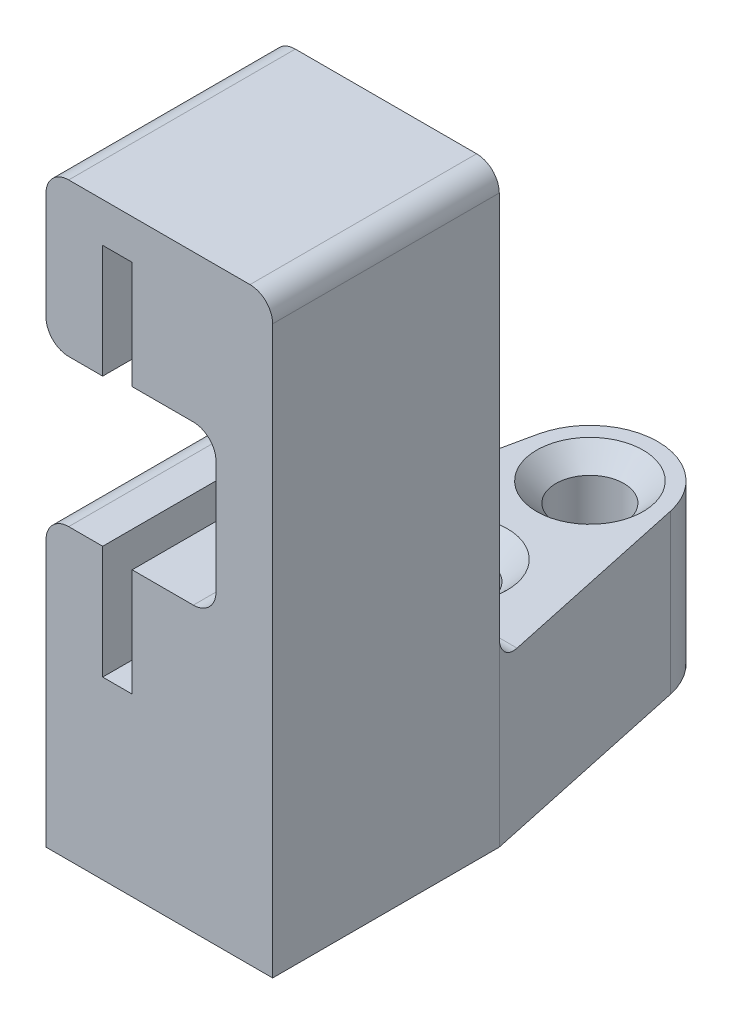
ISO-10303-21;
HEADER;
FILE_DESCRIPTION(('STEP AP214'),'2;1');
FILE_NAME('part.step','',(''),(''),'','','');
FILE_SCHEMA(('AUTOMOTIVE_DESIGN { 1 0 10303 214 1 1 1 1 }'));
ENDSEC;
DATA;
#1=APPLICATION_CONTEXT('core data for automotive mechanical design processes');
#2=APPLICATION_PROTOCOL_DEFINITION('international standard','automotive_design',2000,#1);
#3=PRODUCT_CONTEXT('',#1,'mechanical');
#4=PRODUCT('Part','Part','',(#3));
#5=PRODUCT_RELATED_PRODUCT_CATEGORY('part','',(#4));
#6=PRODUCT_DEFINITION_FORMATION('','',#4);
#7=PRODUCT_DEFINITION_CONTEXT('part definition',#1,'design');
#8=PRODUCT_DEFINITION('design','',#6,#7);
#9=PRODUCT_DEFINITION_SHAPE('','',#8);
#10=(LENGTH_UNIT() NAMED_UNIT(*) SI_UNIT(.MILLI.,.METRE.));
#11=(NAMED_UNIT(*) PLANE_ANGLE_UNIT() SI_UNIT($,.RADIAN.));
#12=(NAMED_UNIT(*) SI_UNIT($,.STERADIAN.) SOLID_ANGLE_UNIT());
#13=UNCERTAINTY_MEASURE_WITH_UNIT(LENGTH_MEASURE(1.E-05),#10,'distance_accuracy_value','');
#14=(GEOMETRIC_REPRESENTATION_CONTEXT(3) GLOBAL_UNCERTAINTY_ASSIGNED_CONTEXT((#13)) GLOBAL_UNIT_ASSIGNED_CONTEXT((#10,
#11,#12)) REPRESENTATION_CONTEXT('',''));
#15=CARTESIAN_POINT('',(0.,0.,0.));
#16=DIRECTION('',(0.,0.,1.));
#17=DIRECTION('',(1.,0.,0.));
#18=AXIS2_PLACEMENT_3D('',#15,#16,#17);
#19=CARTESIAN_POINT('',(0.,0.,-5.));
#20=DIRECTION('',(0.,0.,1.));
#21=DIRECTION('',(1.,0.,0.));
#22=AXIS2_PLACEMENT_3D('',#19,#20,#21);
#23=PLANE('',#22);
#24=DIRECTION('',(0.,1.,0.));
#25=VECTOR('',#24,1.);
#26=CARTESIAN_POINT('',(5.,0.,-5.));
#27=LINE('',#26,#25);
#28=CARTESIAN_POINT('',(5.,8.,-5.));
#29=VERTEX_POINT('',#28);
#30=CARTESIAN_POINT('',(5.,25.,-5.));
#31=VERTEX_POINT('',#30);
#32=EDGE_CURVE('E243',#29,#31,#27,.T.);
#33=ORIENTED_EDGE('',*,*,#32,.F.);
#34=DIRECTION('',(1.,0.,0.));
#35=VECTOR('',#34,1.);
#36=CARTESIAN_POINT('',(0.,8.,-5.));
#37=LINE('',#36,#35);
#38=CARTESIAN_POINT('',(-1.20000000000001,8.,-5.));
#39=VERTEX_POINT('',#38);
#40=EDGE_CURVE('E375',#29,#39,#37,.F.);
#41=ORIENTED_EDGE('',*,*,#40,.T.);
#42=DIRECTION('',(0.,-1.,0.));
#43=VECTOR('',#42,1.);
#44=CARTESIAN_POINT('',(-1.20000000000001,12.5,-5.));
#45=LINE('',#44,#43);
#46=CARTESIAN_POINT('',(-1.20000000000001,12.5,-5.));
#47=VERTEX_POINT('',#46);
#48=EDGE_CURVE('E325',#47,#39,#45,.T.);
#49=ORIENTED_EDGE('',*,*,#48,.F.);
#50=DIRECTION('',(-1.,0.,0.));
#51=VECTOR('',#50,1.);
#52=CARTESIAN_POINT('',(2.5,12.5,-5.));
#53=LINE('',#52,#51);
#54=CARTESIAN_POINT('',(1.5,12.5,-5.));
#55=VERTEX_POINT('',#54);
#56=EDGE_CURVE('E323',#55,#47,#53,.T.);
#57=ORIENTED_EDGE('',*,*,#56,.F.);
#58=CARTESIAN_POINT('',(1.5,13.5,-5.));
#59=DIRECTION('',(0.,0.,1.));
#60=DIRECTION('',(1.,0.,0.));
#61=AXIS2_PLACEMENT_3D('',#58,#59,#60);
#62=CIRCLE('',#61,1.);
#63=CARTESIAN_POINT('',(2.5,13.5,-5.));
#64=VERTEX_POINT('',#63);
#65=EDGE_CURVE('E41',#55,#64,#62,.T.);
#66=ORIENTED_EDGE('',*,*,#65,.T.);
#67=DIRECTION('',(0.,-1.,0.));
#68=VECTOR('',#67,1.);
#69=CARTESIAN_POINT('',(2.5,19.5,-5.));
#70=LINE('',#69,#68);
#71=CARTESIAN_POINT('',(2.5,18.5,-5.));
#72=VERTEX_POINT('',#71);
#73=EDGE_CURVE('E320',#72,#64,#70,.T.);
#74=ORIENTED_EDGE('',*,*,#73,.F.);
#75=CARTESIAN_POINT('',(1.5,18.5,-5.));
#76=DIRECTION('',(0.,0.,1.));
#77=DIRECTION('',(1.,0.,0.));
#78=AXIS2_PLACEMENT_3D('',#75,#76,#77);
#79=CIRCLE('',#78,1.);
#80=CARTESIAN_POINT('',(1.5,19.5,-5.));
#81=VERTEX_POINT('',#80);
#82=EDGE_CURVE('E564',#72,#81,#79,.T.);
#83=ORIENTED_EDGE('',*,*,#82,.T.);
#84=DIRECTION('',(1.,0.,0.));
#85=VECTOR('',#84,1.);
#86=CARTESIAN_POINT('',(-1.20000000000001,19.5,-5.));
#87=LINE('',#86,#85);
#88=CARTESIAN_POINT('',(-1.20000000000001,19.5,-5.));
#89=VERTEX_POINT('',#88);
#90=EDGE_CURVE('E317',#89,#81,#87,.T.);
#91=ORIENTED_EDGE('',*,*,#90,.F.);
#92=DIRECTION('',(0.,-1.,0.));
#93=VECTOR('',#92,1.);
#94=CARTESIAN_POINT('',(-1.20000000000001,24.25,-5.));
#95=LINE('',#94,#93);
#96=CARTESIAN_POINT('',(-1.20000000000001,24.25,-5.));
#97=VERTEX_POINT('',#96);
#98=EDGE_CURVE('E315',#97,#89,#95,.T.);
#99=ORIENTED_EDGE('',*,*,#98,.F.);
#100=DIRECTION('',(1.,0.,0.));
#101=VECTOR('',#100,1.);
#102=CARTESIAN_POINT('',(-2.50000000000001,24.25,-5.));
#103=LINE('',#102,#101);
#104=CARTESIAN_POINT('',(-2.50000000000001,24.25,-5.));
#105=VERTEX_POINT('',#104);
#106=EDGE_CURVE('E313',#105,#97,#103,.T.);
#107=ORIENTED_EDGE('',*,*,#106,.F.);
#108=DIRECTION('',(0.,1.,0.));
#109=VECTOR('',#108,1.);
#110=CARTESIAN_POINT('',(-2.50000000000001,19.25,-5.));
#111=LINE('',#110,#109);
#112=CARTESIAN_POINT('',(-2.50000000000001,19.25,-5.));
#113=VERTEX_POINT('',#112);
#114=EDGE_CURVE('E311',#113,#105,#111,.T.);
#115=ORIENTED_EDGE('',*,*,#114,.F.);
#116=DIRECTION('',(1.,0.,0.));
#117=VECTOR('',#116,1.);
#118=CARTESIAN_POINT('',(-5.00000000000001,19.25,-5.));
#119=LINE('',#118,#117);
#120=CARTESIAN_POINT('',(-4.00000000000001,19.25,-5.));
#121=VERTEX_POINT('',#120);
#122=EDGE_CURVE('E309',#121,#113,#119,.T.);
#123=ORIENTED_EDGE('',*,*,#122,.F.);
#124=CARTESIAN_POINT('',(-4.00000000000001,20.25,-5.));
#125=DIRECTION('',(0.,0.,1.));
#126=DIRECTION('',(1.,0.,0.));
#127=AXIS2_PLACEMENT_3D('',#124,#125,#126);
#128=CIRCLE('',#127,1.);
#129=CARTESIAN_POINT('',(-5.00000000000001,20.25,-5.));
#130=VERTEX_POINT('',#129);
#131=EDGE_CURVE('E370',#121,#130,#128,.F.);
#132=ORIENTED_EDGE('',*,*,#131,.T.);
#133=DIRECTION('',(0.,-1.,0.));
#134=VECTOR('',#133,1.);
#135=CARTESIAN_POINT('',(-5.00000000000001,26.,-5.));
#136=LINE('',#135,#134);
#137=CARTESIAN_POINT('',(-5.00000000000001,25.,-5.));
#138=VERTEX_POINT('',#137);
#139=EDGE_CURVE('E306',#138,#130,#136,.T.);
#140=ORIENTED_EDGE('',*,*,#139,.F.);
#141=CARTESIAN_POINT('',(-4.00000000000001,25.,-5.));
#142=DIRECTION('',(0.,0.,1.));
#143=DIRECTION('',(1.,0.,0.));
#144=AXIS2_PLACEMENT_3D('',#141,#142,#143);
#145=CIRCLE('',#144,1.);
#146=CARTESIAN_POINT('',(-4.00000000000001,26.,-5.));
#147=VERTEX_POINT('',#146);
#148=EDGE_CURVE('E364',#138,#147,#145,.F.);
#149=ORIENTED_EDGE('',*,*,#148,.T.);
#150=DIRECTION('',(-1.,0.,0.));
#151=VECTOR('',#150,1.);
#152=CARTESIAN_POINT('',(5.,26.,-5.));
#153=LINE('',#152,#151);
#154=CARTESIAN_POINT('',(4.,26.,-5.));
#155=VERTEX_POINT('',#154);
#156=EDGE_CURVE('E303',#155,#147,#153,.T.);
#157=ORIENTED_EDGE('',*,*,#156,.F.);
#158=CARTESIAN_POINT('',(4.,25.,-5.));
#159=DIRECTION('',(0.,0.,1.));
#160=DIRECTION('',(1.,0.,0.));
#161=AXIS2_PLACEMENT_3D('',#158,#159,#160);
#162=CIRCLE('',#161,1.);
#163=EDGE_CURVE('E366',#155,#31,#162,.F.);
#164=ORIENTED_EDGE('',*,*,#163,.T.);
#165=EDGE_LOOP('',(#33,#41,#49,#57,#66,#74,#83,#91,#99,#107,#115,#123,#132,#140,#149,#157,#164));
#166=FACE_BOUND('',#165,.T.);
#167=ADVANCED_FACE('F32',(#166),#23,.F.);
#168=DIRECTION('',(0.,1.,0.));
#169=VECTOR('',#168,1.);
#170=CARTESIAN_POINT('',(-2.50000000000001,7.75,-5.));
#171=LINE('',#170,#169);
#172=CARTESIAN_POINT('',(-2.50000000000001,8.,-5.));
#173=VERTEX_POINT('',#172);
#174=CARTESIAN_POINT('',(-2.50000000000001,12.75,-5.));
#175=VERTEX_POINT('',#174);
#176=EDGE_CURVE('E328',#173,#175,#171,.T.);
#177=ORIENTED_EDGE('',*,*,#176,.F.);
#178=DIRECTION('',(1.,0.,0.));
#179=VECTOR('',#178,1.);
#180=CARTESIAN_POINT('',(0.,8.,-5.));
#181=LINE('',#180,#179);
#182=CARTESIAN_POINT('',(-5.00000000000001,8.,-5.));
#183=VERTEX_POINT('',#182);
#184=EDGE_CURVE('E372',#173,#183,#181,.F.);
#185=ORIENTED_EDGE('',*,*,#184,.T.);
#186=DIRECTION('',(0.,-1.,0.));
#187=VECTOR('',#186,1.);
#188=CARTESIAN_POINT('',(-5.00000000000001,12.75,-5.));
#189=LINE('',#188,#187);
#190=CARTESIAN_POINT('',(-5.00000000000001,11.75,-5.));
#191=VERTEX_POINT('',#190);
#192=EDGE_CURVE('E267',#191,#183,#189,.T.);
#193=ORIENTED_EDGE('',*,*,#192,.F.);
#194=CARTESIAN_POINT('',(-4.00000000000001,11.75,-5.));
#195=DIRECTION('',(0.,0.,1.));
#196=DIRECTION('',(1.,0.,0.));
#197=AXIS2_PLACEMENT_3D('',#194,#195,#196);
#198=CIRCLE('',#197,1.);
#199=CARTESIAN_POINT('',(-4.00000000000001,12.75,-5.));
#200=VERTEX_POINT('',#199);
#201=EDGE_CURVE('E368',#191,#200,#198,.F.);
#202=ORIENTED_EDGE('',*,*,#201,.T.);
#203=DIRECTION('',(-1.,0.,0.));
#204=VECTOR('',#203,1.);
#205=CARTESIAN_POINT('',(-2.50000000000001,12.75,-5.));
#206=LINE('',#205,#204);
#207=EDGE_CURVE('E330',#175,#200,#206,.T.);
#208=ORIENTED_EDGE('',*,*,#207,.F.);
#209=EDGE_LOOP('',(#177,#185,#193,#202,#208));
#210=FACE_BOUND('',#209,.T.);
#211=ADVANCED_FACE('F461',(#210),#23,.F.);
#212=CARTESIAN_POINT('',(5.,0.,5.));
#213=DIRECTION('',(-1.,0.,0.));
#214=DIRECTION('',(0.,0.,1.));
#215=AXIS2_PLACEMENT_3D('',#212,#213,#214);
#216=PLANE('',#215);
#217=ORIENTED_EDGE('',*,*,#32,.T.);
#218=DIRECTION('',(0.,0.,-1.));
#219=VECTOR('',#218,1.);
#220=CARTESIAN_POINT('',(5.,25.,5.));
#221=LINE('',#220,#219);
#222=CARTESIAN_POINT('',(5.,25.,5.));
#223=VERTEX_POINT('',#222);
#224=EDGE_CURVE('E412',#31,#223,#221,.F.);
#225=ORIENTED_EDGE('',*,*,#224,.T.);
#226=DIRECTION('',(0.,1.,0.));
#227=VECTOR('',#226,1.);
#228=CARTESIAN_POINT('',(5.,0.,5.));
#229=LINE('',#228,#227);
#230=CARTESIAN_POINT('',(5.,0.,5.));
#231=VERTEX_POINT('',#230);
#232=EDGE_CURVE('E263',#231,#223,#229,.T.);
#233=ORIENTED_EDGE('',*,*,#232,.F.);
#234=DIRECTION('',(0.,0.,-1.));
#235=VECTOR('',#234,1.);
#236=CARTESIAN_POINT('',(5.,0.,5.));
#237=LINE('',#236,#235);
#238=CARTESIAN_POINT('',(5.,0.,-5.));
#239=VERTEX_POINT('',#238);
#240=EDGE_CURVE('E301',#231,#239,#237,.T.);
#241=ORIENTED_EDGE('',*,*,#240,.T.);
#242=EDGE_CURVE('E61',#239,#29,#27,.T.);
#243=ORIENTED_EDGE('',*,*,#242,.T.);
#244=EDGE_LOOP('',(#217,#225,#233,#241,#243));
#245=FACE_BOUND('',#244,.T.);
#246=ADVANCED_FACE('F436',(#245),#216,.F.);
#247=CARTESIAN_POINT('',(5.,26.,5.));
#248=DIRECTION('',(0.,-1.,0.));
#249=DIRECTION('',(1.,0.,0.));
#250=AXIS2_PLACEMENT_3D('',#247,#248,#249);
#251=PLANE('',#250);
#252=DIRECTION('',(-1.,0.,0.));
#253=VECTOR('',#252,1.);
#254=CARTESIAN_POINT('',(5.,26.,5.));
#255=LINE('',#254,#253);
#256=CARTESIAN_POINT('',(4.,26.,5.));
#257=VERTEX_POINT('',#256);
#258=CARTESIAN_POINT('',(-4.00000000000001,26.,5.));
#259=VERTEX_POINT('',#258);
#260=EDGE_CURVE('E266',#257,#259,#255,.T.);
#261=ORIENTED_EDGE('',*,*,#260,.F.);
#262=DIRECTION('',(0.,0.,-1.));
#263=VECTOR('',#262,1.);
#264=CARTESIAN_POINT('',(4.,26.,5.));
#265=LINE('',#264,#263);
#266=EDGE_CURVE('E409',#257,#155,#265,.T.);
#267=ORIENTED_EDGE('',*,*,#266,.T.);
#268=ORIENTED_EDGE('',*,*,#156,.T.);
#269=DIRECTION('',(0.,0.,-1.));
#270=VECTOR('',#269,1.);
#271=CARTESIAN_POINT('',(-4.00000000000001,26.,5.));
#272=LINE('',#271,#270);
#273=EDGE_CURVE('E407',#147,#259,#272,.F.);
#274=ORIENTED_EDGE('',*,*,#273,.T.);
#275=EDGE_LOOP('',(#261,#267,#268,#274));
#276=FACE_BOUND('',#275,.T.);
#277=ADVANCED_FACE('F525',(#276),#251,.F.);
#278=CARTESIAN_POINT('',(-5.00000000000001,26.,5.));
#279=DIRECTION('',(1.,0.,0.));
#280=DIRECTION('',(0.,1.,0.));
#281=AXIS2_PLACEMENT_3D('',#278,#279,#280);
#282=PLANE('',#281);
#283=ORIENTED_EDGE('',*,*,#139,.T.);
#284=DIRECTION('',(0.,0.,-1.));
#285=VECTOR('',#284,1.);
#286=CARTESIAN_POINT('',(-5.00000000000001,20.25,5.));
#287=LINE('',#286,#285);
#288=CARTESIAN_POINT('',(-5.00000000000001,20.25,5.));
#289=VERTEX_POINT('',#288);
#290=EDGE_CURVE('E390',#130,#289,#287,.F.);
#291=ORIENTED_EDGE('',*,*,#290,.T.);
#292=DIRECTION('',(0.,-1.,0.));
#293=VECTOR('',#292,1.);
#294=CARTESIAN_POINT('',(-5.00000000000001,26.,5.));
#295=LINE('',#294,#293);
#296=CARTESIAN_POINT('',(-5.00000000000001,25.,5.));
#297=VERTEX_POINT('',#296);
#298=EDGE_CURVE('E270',#297,#289,#295,.T.);
#299=ORIENTED_EDGE('',*,*,#298,.F.);
#300=DIRECTION('',(0.,0.,-1.));
#301=VECTOR('',#300,1.);
#302=CARTESIAN_POINT('',(-5.00000000000001,25.,5.));
#303=LINE('',#302,#301);
#304=EDGE_CURVE('E387',#297,#138,#303,.T.);
#305=ORIENTED_EDGE('',*,*,#304,.T.);
#306=EDGE_LOOP('',(#283,#291,#299,#305));
#307=FACE_BOUND('',#306,.T.);
#308=ADVANCED_FACE('F522',(#307),#282,.F.);
#309=CARTESIAN_POINT('',(-5.00000000000001,19.25,5.));
#310=DIRECTION('',(0.,1.,0.));
#311=DIRECTION('',(-1.,0.,0.));
#312=AXIS2_PLACEMENT_3D('',#309,#310,#311);
#313=PLANE('',#312);
#314=DIRECTION('',(1.,0.,0.));
#315=VECTOR('',#314,1.);
#316=CARTESIAN_POINT('',(-5.00000000000001,19.25,5.));
#317=LINE('',#316,#315);
#318=CARTESIAN_POINT('',(-4.00000000000001,19.25,5.));
#319=VERTEX_POINT('',#318);
#320=CARTESIAN_POINT('',(-2.50000000000001,19.25,5.));
#321=VERTEX_POINT('',#320);
#322=EDGE_CURVE('E273',#319,#321,#317,.T.);
#323=ORIENTED_EDGE('',*,*,#322,.F.);
#324=DIRECTION('',(0.,0.,-1.));
#325=VECTOR('',#324,1.);
#326=CARTESIAN_POINT('',(-4.00000000000001,19.25,5.));
#327=LINE('',#326,#325);
#328=EDGE_CURVE('E384',#319,#121,#327,.T.);
#329=ORIENTED_EDGE('',*,*,#328,.T.);
#330=ORIENTED_EDGE('',*,*,#122,.T.);
#331=DIRECTION('',(0.,0.,-1.));
#332=VECTOR('',#331,1.);
#333=CARTESIAN_POINT('',(-2.50000000000001,19.25,5.));
#334=LINE('',#333,#332);
#335=EDGE_CURVE('E357',#321,#113,#334,.T.);
#336=ORIENTED_EDGE('',*,*,#335,.F.);
#337=EDGE_LOOP('',(#323,#329,#330,#336));
#338=FACE_BOUND('',#337,.T.);
#339=ADVANCED_FACE('F518',(#338),#313,.F.);
#340=CARTESIAN_POINT('',(-2.50000000000001,19.25,5.));
#341=DIRECTION('',(-1.,0.,0.));
#342=DIRECTION('',(0.,-1.,0.));
#343=AXIS2_PLACEMENT_3D('',#340,#341,#342);
#344=PLANE('',#343);
#345=ORIENTED_EDGE('',*,*,#114,.T.);
#346=DIRECTION('',(0.,0.,-1.));
#347=VECTOR('',#346,1.);
#348=CARTESIAN_POINT('',(-2.50000000000001,24.25,5.));
#349=LINE('',#348,#347);
#350=CARTESIAN_POINT('',(-2.50000000000001,24.25,5.));
#351=VERTEX_POINT('',#350);
#352=EDGE_CURVE('E354',#351,#105,#349,.T.);
#353=ORIENTED_EDGE('',*,*,#352,.F.);
#354=DIRECTION('',(0.,1.,0.));
#355=VECTOR('',#354,1.);
#356=CARTESIAN_POINT('',(-2.50000000000001,19.25,5.));
#357=LINE('',#356,#355);
#358=EDGE_CURVE('E275',#321,#351,#357,.T.);
#359=ORIENTED_EDGE('',*,*,#358,.F.);
#360=ORIENTED_EDGE('',*,*,#335,.T.);
#361=EDGE_LOOP('',(#345,#353,#359,#360));
#362=FACE_BOUND('',#361,.T.);
#363=ADVANCED_FACE('F514',(#362),#344,.F.);
#364=CARTESIAN_POINT('',(-2.50000000000001,24.25,5.));
#365=DIRECTION('',(0.,1.,0.));
#366=DIRECTION('',(0.,0.,1.));
#367=AXIS2_PLACEMENT_3D('',#364,#365,#366);
#368=PLANE('',#367);
#369=ORIENTED_EDGE('',*,*,#106,.T.);
#370=DIRECTION('',(0.,0.,-1.));
#371=VECTOR('',#370,1.);
#372=CARTESIAN_POINT('',(-1.20000000000001,24.25,5.));
#373=LINE('',#372,#371);
#374=CARTESIAN_POINT('',(-1.20000000000001,24.25,5.));
#375=VERTEX_POINT('',#374);
#376=EDGE_CURVE('E351',#375,#97,#373,.T.);
#377=ORIENTED_EDGE('',*,*,#376,.F.);
#378=DIRECTION('',(1.,0.,0.));
#379=VECTOR('',#378,1.);
#380=CARTESIAN_POINT('',(-2.50000000000001,24.25,5.));
#381=LINE('',#380,#379);
#382=EDGE_CURVE('E277',#351,#375,#381,.T.);
#383=ORIENTED_EDGE('',*,*,#382,.F.);
#384=ORIENTED_EDGE('',*,*,#352,.T.);
#385=EDGE_LOOP('',(#369,#377,#383,#384));
#386=FACE_BOUND('',#385,.T.);
#387=ADVANCED_FACE('F510',(#386),#368,.F.);
#388=CARTESIAN_POINT('',(-1.20000000000001,24.25,5.));
#389=DIRECTION('',(1.,0.,0.));
#390=DIRECTION('',(0.,0.,-1.));
#391=AXIS2_PLACEMENT_3D('',#388,#389,#390);
#392=PLANE('',#391);
#393=ORIENTED_EDGE('',*,*,#98,.T.);
#394=DIRECTION('',(0.,0.,-1.));
#395=VECTOR('',#394,1.);
#396=CARTESIAN_POINT('',(-1.20000000000001,19.5,5.));
#397=LINE('',#396,#395);
#398=CARTESIAN_POINT('',(-1.20000000000001,19.5,5.));
#399=VERTEX_POINT('',#398);
#400=EDGE_CURVE('E348',#399,#89,#397,.T.);
#401=ORIENTED_EDGE('',*,*,#400,.F.);
#402=DIRECTION('',(0.,-1.,0.));
#403=VECTOR('',#402,1.);
#404=CARTESIAN_POINT('',(-1.20000000000001,24.25,5.));
#405=LINE('',#404,#403);
#406=EDGE_CURVE('E279',#375,#399,#405,.T.);
#407=ORIENTED_EDGE('',*,*,#406,.F.);
#408=ORIENTED_EDGE('',*,*,#376,.T.);
#409=EDGE_LOOP('',(#393,#401,#407,#408));
#410=FACE_BOUND('',#409,.T.);
#411=ADVANCED_FACE('F506',(#410),#392,.F.);
#412=CARTESIAN_POINT('',(-1.20000000000001,19.5,5.));
#413=DIRECTION('',(0.,1.,0.));
#414=DIRECTION('',(0.,0.,1.));
#415=AXIS2_PLACEMENT_3D('',#412,#413,#414);
#416=PLANE('',#415);
#417=ORIENTED_EDGE('',*,*,#90,.T.);
#418=DIRECTION('',(0.,0.,-1.));
#419=VECTOR('',#418,1.);
#420=CARTESIAN_POINT('',(1.5,19.5,5.));
#421=LINE('',#420,#419);
#422=CARTESIAN_POINT('',(1.5,19.5,5.));
#423=VERTEX_POINT('',#422);
#424=EDGE_CURVE('E382',#81,#423,#421,.F.);
#425=ORIENTED_EDGE('',*,*,#424,.T.);
#426=DIRECTION('',(1.,0.,0.));
#427=VECTOR('',#426,1.);
#428=CARTESIAN_POINT('',(-1.20000000000001,19.5,5.));
#429=LINE('',#428,#427);
#430=EDGE_CURVE('E281',#399,#423,#429,.T.);
#431=ORIENTED_EDGE('',*,*,#430,.F.);
#432=ORIENTED_EDGE('',*,*,#400,.T.);
#433=EDGE_LOOP('',(#417,#425,#431,#432));
#434=FACE_BOUND('',#433,.T.);
#435=ADVANCED_FACE('F502',(#434),#416,.F.);
#436=CARTESIAN_POINT('',(2.5,19.5,5.));
#437=DIRECTION('',(1.,0.,0.));
#438=DIRECTION('',(0.,1.,0.));
#439=AXIS2_PLACEMENT_3D('',#436,#437,#438);
#440=PLANE('',#439);
#441=DIRECTION('',(0.,-1.,0.));
#442=VECTOR('',#441,1.);
#443=CARTESIAN_POINT('',(2.5,19.5,5.));
#444=LINE('',#443,#442);
#445=CARTESIAN_POINT('',(2.5,18.5,5.));
#446=VERTEX_POINT('',#445);
#447=CARTESIAN_POINT('',(2.5,13.5,5.));
#448=VERTEX_POINT('',#447);
#449=EDGE_CURVE('E284',#446,#448,#444,.T.);
#450=ORIENTED_EDGE('',*,*,#449,.F.);
#451=DIRECTION('',(0.,0.,-1.));
#452=VECTOR('',#451,1.);
#453=CARTESIAN_POINT('',(2.5,18.5,-5.));
#454=LINE('',#453,#452);
#455=EDGE_CURVE('E379',#446,#72,#454,.T.);
#456=ORIENTED_EDGE('',*,*,#455,.T.);
#457=ORIENTED_EDGE('',*,*,#73,.T.);
#458=DIRECTION('',(0.,0.,-1.));
#459=VECTOR('',#458,1.);
#460=CARTESIAN_POINT('',(2.5,13.5,5.));
#461=LINE('',#460,#459);
#462=EDGE_CURVE('E377',#64,#448,#461,.F.);
#463=ORIENTED_EDGE('',*,*,#462,.T.);
#464=EDGE_LOOP('',(#450,#456,#457,#463));
#465=FACE_BOUND('',#464,.T.);
#466=ADVANCED_FACE('F498',(#465),#440,.F.);
#467=CARTESIAN_POINT('',(2.5,12.5,5.));
#468=DIRECTION('',(0.,-1.,0.));
#469=DIRECTION('',(0.,0.,-1.));
#470=AXIS2_PLACEMENT_3D('',#467,#468,#469);
#471=PLANE('',#470);
#472=DIRECTION('',(-1.,0.,0.));
#473=VECTOR('',#472,1.);
#474=CARTESIAN_POINT('',(2.5,12.5,5.));
#475=LINE('',#474,#473);
#476=CARTESIAN_POINT('',(1.5,12.5,5.));
#477=VERTEX_POINT('',#476);
#478=CARTESIAN_POINT('',(-1.20000000000001,12.5,5.));
#479=VERTEX_POINT('',#478);
#480=EDGE_CURVE('E287',#477,#479,#475,.T.);
#481=ORIENTED_EDGE('',*,*,#480,.F.);
#482=DIRECTION('',(0.,0.,-1.));
#483=VECTOR('',#482,1.);
#484=CARTESIAN_POINT('',(1.5,12.5,-5.));
#485=LINE('',#484,#483);
#486=EDGE_CURVE('E404',#477,#55,#485,.T.);
#487=ORIENTED_EDGE('',*,*,#486,.T.);
#488=ORIENTED_EDGE('',*,*,#56,.T.);
#489=DIRECTION('',(0.,0.,-1.));
#490=VECTOR('',#489,1.);
#491=CARTESIAN_POINT('',(-1.20000000000001,12.5,5.));
#492=LINE('',#491,#490);
#493=EDGE_CURVE('E345',#479,#47,#492,.T.);
#494=ORIENTED_EDGE('',*,*,#493,.F.);
#495=EDGE_LOOP('',(#481,#487,#488,#494));
#496=FACE_BOUND('',#495,.T.);
#497=ADVANCED_FACE('F494',(#496),#471,.F.);
#498=CARTESIAN_POINT('',(-1.20000000000001,12.5,5.));
#499=DIRECTION('',(1.,0.,0.));
#500=DIRECTION('',(0.,1.,0.));
#501=AXIS2_PLACEMENT_3D('',#498,#499,#500);
#502=PLANE('',#501);
#503=ORIENTED_EDGE('',*,*,#48,.T.);
#504=CARTESIAN_POINT('',(-1.20000000000001,8.,-6.));
#505=DIRECTION('',(1.,0.,0.));
#506=DIRECTION('',(0.,1.,0.));
#507=AXIS2_PLACEMENT_3D('',#504,#505,#506);
#508=CIRCLE('',#507,1.);
#509=CARTESIAN_POINT('',(-1.20000000000001,7.75,-5.03175416344815));
#510=VERTEX_POINT('',#509);
#511=EDGE_CURVE('E545',#39,#510,#508,.T.);
#512=ORIENTED_EDGE('',*,*,#511,.T.);
#513=DIRECTION('',(0.,0.,-1.));
#514=VECTOR('',#513,1.);
#515=CARTESIAN_POINT('',(-1.20000000000001,7.75,5.));
#516=LINE('',#515,#514);
#517=CARTESIAN_POINT('',(-1.20000000000001,7.75,5.));
#518=VERTEX_POINT('',#517);
#519=EDGE_CURVE('E343',#518,#510,#516,.T.);
#520=ORIENTED_EDGE('',*,*,#519,.F.);
#521=DIRECTION('',(0.,-1.,0.));
#522=VECTOR('',#521,1.);
#523=CARTESIAN_POINT('',(-1.20000000000001,12.5,5.));
#524=LINE('',#523,#522);
#525=EDGE_CURVE('E289',#479,#518,#524,.T.);
#526=ORIENTED_EDGE('',*,*,#525,.F.);
#527=ORIENTED_EDGE('',*,*,#493,.T.);
#528=EDGE_LOOP('',(#503,#512,#520,#526,#527));
#529=FACE_BOUND('',#528,.T.);
#530=ADVANCED_FACE('F490',(#529),#502,.F.);
#531=CARTESIAN_POINT('',(-1.20000000000001,7.75,5.));
#532=DIRECTION('',(0.,-1.,0.));
#533=DIRECTION('',(0.,0.,-1.));
#534=AXIS2_PLACEMENT_3D('',#531,#532,#533);
#535=PLANE('',#534);
#536=ORIENTED_EDGE('',*,*,#519,.T.);
#537=DIRECTION('',(1.,0.,0.));
#538=VECTOR('',#537,1.);
#539=CARTESIAN_POINT('',(-1.20000000000001,7.75,-5.03175416344815));
#540=LINE('',#539,#538);
#541=CARTESIAN_POINT('',(-2.50000000000001,7.75,-5.03175416344815));
#542=VERTEX_POINT('',#541);
#543=EDGE_CURVE('E573',#510,#542,#540,.F.);
#544=ORIENTED_EDGE('',*,*,#543,.T.);
#545=DIRECTION('',(0.,0.,-1.));
#546=VECTOR('',#545,1.);
#547=CARTESIAN_POINT('',(-2.50000000000001,7.75,5.));
#548=LINE('',#547,#546);
#549=CARTESIAN_POINT('',(-2.50000000000001,7.75,5.));
#550=VERTEX_POINT('',#549);
#551=EDGE_CURVE('E49',#550,#542,#548,.T.);
#552=ORIENTED_EDGE('',*,*,#551,.F.);
#553=DIRECTION('',(-1.,0.,0.));
#554=VECTOR('',#553,1.);
#555=CARTESIAN_POINT('',(-1.20000000000001,7.75,5.));
#556=LINE('',#555,#554);
#557=EDGE_CURVE('E291',#518,#550,#556,.T.);
#558=ORIENTED_EDGE('',*,*,#557,.F.);
#559=EDGE_LOOP('',(#536,#544,#552,#558));
#560=FACE_BOUND('',#559,.T.);
#561=ADVANCED_FACE('F487',(#560),#535,.F.);
#562=CARTESIAN_POINT('',(-2.50000000000001,7.75,5.));
#563=DIRECTION('',(-1.,0.,0.));
#564=DIRECTION('',(0.,-1.,0.));
#565=AXIS2_PLACEMENT_3D('',#562,#563,#564);
#566=PLANE('',#565);
#567=ORIENTED_EDGE('',*,*,#551,.T.);
#568=CARTESIAN_POINT('',(-2.50000000000001,8.,-6.));
#569=DIRECTION('',(-1.,0.,0.));
#570=DIRECTION('',(0.,-1.,0.));
#571=AXIS2_PLACEMENT_3D('',#568,#569,#570);
#572=CIRCLE('',#571,1.);
#573=EDGE_CURVE('E569',#542,#173,#572,.T.);
#574=ORIENTED_EDGE('',*,*,#573,.T.);
#575=ORIENTED_EDGE('',*,*,#176,.T.);
#576=DIRECTION('',(0.,0.,-1.));
#577=VECTOR('',#576,1.);
#578=CARTESIAN_POINT('',(-2.50000000000001,12.75,5.));
#579=LINE('',#578,#577);
#580=CARTESIAN_POINT('',(-2.50000000000001,12.75,5.));
#581=VERTEX_POINT('',#580);
#582=EDGE_CURVE('E339',#581,#175,#579,.T.);
#583=ORIENTED_EDGE('',*,*,#582,.F.);
#584=DIRECTION('',(0.,1.,0.));
#585=VECTOR('',#584,1.);
#586=CARTESIAN_POINT('',(-2.50000000000001,7.75,5.));
#587=LINE('',#586,#585);
#588=EDGE_CURVE('E293',#550,#581,#587,.T.);
#589=ORIENTED_EDGE('',*,*,#588,.F.);
#590=EDGE_LOOP('',(#567,#574,#575,#583,#589));
#591=FACE_BOUND('',#590,.T.);
#592=ADVANCED_FACE('F483',(#591),#566,.F.);
#593=CARTESIAN_POINT('',(-2.50000000000001,12.75,5.));
#594=DIRECTION('',(0.,-1.,0.));
#595=DIRECTION('',(0.,0.,-1.));
#596=AXIS2_PLACEMENT_3D('',#593,#594,#595);
#597=PLANE('',#596);
#598=ORIENTED_EDGE('',*,*,#207,.T.);
#599=DIRECTION('',(0.,0.,-1.));
#600=VECTOR('',#599,1.);
#601=CARTESIAN_POINT('',(-4.00000000000001,12.75,5.));
#602=LINE('',#601,#600);
#603=CARTESIAN_POINT('',(-4.00000000000001,12.75,5.));
#604=VERTEX_POINT('',#603);
#605=EDGE_CURVE('E402',#200,#604,#602,.F.);
#606=ORIENTED_EDGE('',*,*,#605,.T.);
#607=DIRECTION('',(-1.,0.,0.));
#608=VECTOR('',#607,1.);
#609=CARTESIAN_POINT('',(-2.50000000000001,12.75,5.));
#610=LINE('',#609,#608);
#611=EDGE_CURVE('E295',#581,#604,#610,.T.);
#612=ORIENTED_EDGE('',*,*,#611,.F.);
#613=ORIENTED_EDGE('',*,*,#582,.T.);
#614=EDGE_LOOP('',(#598,#606,#612,#613));
#615=FACE_BOUND('',#614,.T.);
#616=ADVANCED_FACE('F479',(#615),#597,.F.);
#617=CARTESIAN_POINT('',(-5.00000000000001,12.75,5.));
#618=DIRECTION('',(1.,0.,0.));
#619=DIRECTION('',(0.,1.,0.));
#620=AXIS2_PLACEMENT_3D('',#617,#618,#619);
#621=PLANE('',#620);
#622=DIRECTION('',(0.,-1.,0.));
#623=VECTOR('',#622,1.);
#624=CARTESIAN_POINT('',(-5.00000000000001,12.75,5.));
#625=LINE('',#624,#623);
#626=CARTESIAN_POINT('',(-5.00000000000001,11.75,5.));
#627=VERTEX_POINT('',#626);
#628=CARTESIAN_POINT('',(-5.,0.,5.));
#629=VERTEX_POINT('',#628);
#630=EDGE_CURVE('E297',#627,#629,#625,.T.);
#631=ORIENTED_EDGE('',*,*,#630,.F.);
#632=DIRECTION('',(0.,0.,-1.));
#633=VECTOR('',#632,1.);
#634=CARTESIAN_POINT('',(-5.00000000000001,11.75,5.));
#635=LINE('',#634,#633);
#636=EDGE_CURVE('E399',#627,#191,#635,.T.);
#637=ORIENTED_EDGE('',*,*,#636,.T.);
#638=ORIENTED_EDGE('',*,*,#192,.T.);
#639=DIRECTION('',(0.,-1.,0.));
#640=VECTOR('',#639,1.);
#641=CARTESIAN_POINT('',(-5.00000000000001,7.,-5.));
#642=LINE('',#641,#640);
#643=CARTESIAN_POINT('',(-5.,0.,-5.));
#644=VERTEX_POINT('',#643);
#645=EDGE_CURVE('E251',#183,#644,#642,.T.);
#646=ORIENTED_EDGE('',*,*,#645,.T.);
#647=DIRECTION('',(0.,0.,-1.));
#648=VECTOR('',#647,1.);
#649=CARTESIAN_POINT('',(-5.,0.,5.));
#650=LINE('',#649,#648);
#651=EDGE_CURVE('E336',#629,#644,#650,.T.);
#652=ORIENTED_EDGE('',*,*,#651,.F.);
#653=EDGE_LOOP('',(#631,#637,#638,#646,#652));
#654=FACE_BOUND('',#653,.T.);
#655=ADVANCED_FACE('F475',(#654),#621,.F.);
#656=CARTESIAN_POINT('',(-5.,0.,5.));
#657=DIRECTION('',(0.,1.,0.));
#658=DIRECTION('',(-1.,0.,0.));
#659=AXIS2_PLACEMENT_3D('',#656,#657,#658);
#660=PLANE('',#659);
#661=CARTESIAN_POINT('',(0.,0.,-14.));
#662=DIRECTION('',(0.,1.,0.));
#663=DIRECTION('',(0.,0.,1.));
#664=AXIS2_PLACEMENT_3D('',#661,#662,#663);
#665=CIRCLE('',#664,1.5);
#666=CARTESIAN_POINT('',(0.,0.,-12.5));
#667=VERTEX_POINT('',#666);
#668=EDGE_CURVE('E593',#667,#667,#665,.T.);
#669=ORIENTED_EDGE('',*,*,#668,.T.);
#670=EDGE_LOOP('',(#669));
#671=FACE_BOUND('',#670,.T.);
#672=CARTESIAN_POINT('',(0.,0.,-8.));
#673=DIRECTION('',(0.,1.,0.));
#674=DIRECTION('',(0.,0.,1.));
#675=AXIS2_PLACEMENT_3D('',#672,#673,#674);
#676=CIRCLE('',#675,1.5);
#677=CARTESIAN_POINT('',(0.,0.,-6.5));
#678=VERTEX_POINT('',#677);
#679=EDGE_CURVE('E257',#678,#678,#676,.T.);
#680=ORIENTED_EDGE('',*,*,#679,.T.);
#681=EDGE_LOOP('',(#680));
#682=FACE_BOUND('',#681,.T.);
#683=ORIENTED_EDGE('',*,*,#651,.T.);
#684=DIRECTION('',(-0.20985178310359,0.,0.977733209586462));
#685=VECTOR('',#684,1.);
#686=CARTESIAN_POINT('',(-2.93319962875939,0.,-14.6295553493108));
#687=LINE('',#686,#685);
#688=CARTESIAN_POINT('',(-2.93319962875939,0.,-14.6295553493108));
#689=VERTEX_POINT('',#688);
#690=EDGE_CURVE('E234',#689,#644,#687,.T.);
#691=ORIENTED_EDGE('',*,*,#690,.F.);
#692=CARTESIAN_POINT('',(0.,0.,-14.));
#693=DIRECTION('',(0.,1.,0.));
#694=DIRECTION('',(0.,0.,1.));
#695=AXIS2_PLACEMENT_3D('',#692,#693,#694);
#696=CIRCLE('',#695,3.);
#697=CARTESIAN_POINT('',(2.93319962875938,0.,-14.6295553493108));
#698=VERTEX_POINT('',#697);
#699=EDGE_CURVE('E256',#698,#689,#696,.T.);
#700=ORIENTED_EDGE('',*,*,#699,.F.);
#701=DIRECTION('',(-0.20985178310359,0.,-0.977733209586462));
#702=VECTOR('',#701,1.);
#703=CARTESIAN_POINT('',(5.,0.,-5.));
#704=LINE('',#703,#702);
#705=EDGE_CURVE('E240',#239,#698,#704,.T.);
#706=ORIENTED_EDGE('',*,*,#705,.F.);
#707=ORIENTED_EDGE('',*,*,#240,.F.);
#708=DIRECTION('',(1.,0.,0.));
#709=VECTOR('',#708,1.);
#710=CARTESIAN_POINT('',(-5.,0.,5.));
#711=LINE('',#710,#709);
#712=EDGE_CURVE('E299',#629,#231,#711,.T.);
#713=ORIENTED_EDGE('',*,*,#712,.F.);
#714=EDGE_LOOP('',(#683,#691,#700,#706,#707,#713));
#715=FACE_BOUND('',#714,.T.);
#716=ADVANCED_FACE('F472',(#671,#682,#715),#660,.F.);
#717=CARTESIAN_POINT('',(0.,0.,5.));
#718=DIRECTION('',(0.,0.,1.));
#719=DIRECTION('',(1.,0.,0.));
#720=AXIS2_PLACEMENT_3D('',#717,#718,#719);
#721=PLANE('',#720);
#722=ORIENTED_EDGE('',*,*,#298,.T.);
#723=CARTESIAN_POINT('',(-4.00000000000001,20.25,5.));
#724=DIRECTION('',(0.,0.,1.));
#725=DIRECTION('',(1.,0.,0.));
#726=AXIS2_PLACEMENT_3D('',#723,#724,#725);
#727=CIRCLE('',#726,1.);
#728=EDGE_CURVE('E397',#289,#319,#727,.T.);
#729=ORIENTED_EDGE('',*,*,#728,.T.);
#730=ORIENTED_EDGE('',*,*,#322,.T.);
#731=ORIENTED_EDGE('',*,*,#358,.T.);
#732=ORIENTED_EDGE('',*,*,#382,.T.);
#733=ORIENTED_EDGE('',*,*,#406,.T.);
#734=ORIENTED_EDGE('',*,*,#430,.T.);
#735=CARTESIAN_POINT('',(1.5,18.5,5.));
#736=DIRECTION('',(0.,0.,1.));
#737=DIRECTION('',(1.,0.,0.));
#738=AXIS2_PLACEMENT_3D('',#735,#736,#737);
#739=CIRCLE('',#738,1.);
#740=EDGE_CURVE('E558',#423,#446,#739,.F.);
#741=ORIENTED_EDGE('',*,*,#740,.T.);
#742=ORIENTED_EDGE('',*,*,#449,.T.);
#743=CARTESIAN_POINT('',(1.5,13.5,5.));
#744=DIRECTION('',(0.,0.,1.));
#745=DIRECTION('',(1.,0.,0.));
#746=AXIS2_PLACEMENT_3D('',#743,#744,#745);
#747=CIRCLE('',#746,1.);
#748=EDGE_CURVE('E11',#448,#477,#747,.F.);
#749=ORIENTED_EDGE('',*,*,#748,.T.);
#750=ORIENTED_EDGE('',*,*,#480,.T.);
#751=ORIENTED_EDGE('',*,*,#525,.T.);
#752=ORIENTED_EDGE('',*,*,#557,.T.);
#753=ORIENTED_EDGE('',*,*,#588,.T.);
#754=ORIENTED_EDGE('',*,*,#611,.T.);
#755=CARTESIAN_POINT('',(-4.00000000000001,11.75,5.));
#756=DIRECTION('',(0.,0.,1.));
#757=DIRECTION('',(1.,0.,0.));
#758=AXIS2_PLACEMENT_3D('',#755,#756,#757);
#759=CIRCLE('',#758,1.);
#760=EDGE_CURVE('E69',#604,#627,#759,.T.);
#761=ORIENTED_EDGE('',*,*,#760,.T.);
#762=ORIENTED_EDGE('',*,*,#630,.T.);
#763=ORIENTED_EDGE('',*,*,#712,.T.);
#764=ORIENTED_EDGE('',*,*,#232,.T.);
#765=CARTESIAN_POINT('',(4.,25.,5.));
#766=DIRECTION('',(0.,0.,1.));
#767=DIRECTION('',(1.,0.,0.));
#768=AXIS2_PLACEMENT_3D('',#765,#766,#767);
#769=CIRCLE('',#768,1.);
#770=EDGE_CURVE('E394',#223,#257,#769,.T.);
#771=ORIENTED_EDGE('',*,*,#770,.T.);
#772=ORIENTED_EDGE('',*,*,#260,.T.);
#773=CARTESIAN_POINT('',(-4.00000000000001,25.,5.));
#774=DIRECTION('',(0.,0.,1.));
#775=DIRECTION('',(1.,0.,0.));
#776=AXIS2_PLACEMENT_3D('',#773,#774,#775);
#777=CIRCLE('',#776,1.);
#778=EDGE_CURVE('E392',#259,#297,#777,.T.);
#779=ORIENTED_EDGE('',*,*,#778,.T.);
#780=EDGE_LOOP('',(#722,#729,#730,#731,#732,#733,#734,#741,#742,#749,#750,#751,#752,#753,#754,
#761,#762,#763,#764,#771,#772,#779));
#781=FACE_BOUND('',#780,.T.);
#782=ADVANCED_FACE('F470',(#781),#721,.T.);
#783=CARTESIAN_POINT('',(5.,7.,-5.));
#784=DIRECTION('',(-0.977733209586462,0.,0.20985178310359));
#785=DIRECTION('',(0.20985178310359,0.,0.977733209586462));
#786=AXIS2_PLACEMENT_3D('',#783,#784,#785);
#787=PLANE('',#786);
#788=ORIENTED_EDGE('',*,*,#705,.T.);
#789=DIRECTION('',(0.,-1.,0.));
#790=VECTOR('',#789,1.);
#791=CARTESIAN_POINT('',(2.93319962875938,7.,-14.6295553493108));
#792=LINE('',#791,#790);
#793=CARTESIAN_POINT('',(2.93319962875938,7.,-14.6295553493108));
#794=VERTEX_POINT('',#793);
#795=EDGE_CURVE('E237',#794,#698,#792,.T.);
#796=ORIENTED_EDGE('',*,*,#795,.F.);
#797=DIRECTION('',(-0.20985178310359,0.,-0.977733209586462));
#798=VECTOR('',#797,1.);
#799=CARTESIAN_POINT('',(5.,7.,-5.));
#800=LINE('',#799,#798);
#801=CARTESIAN_POINT('',(4.78536907507484,7.,-6.));
#802=VERTEX_POINT('',#801);
#803=EDGE_CURVE('E221',#802,#794,#800,.T.);
#804=ORIENTED_EDGE('',*,*,#803,.F.);
#805=CARTESIAN_POINT('',(4.78536907507484,8.,-6.));
#806=DIRECTION('',(-0.977733209586462,0.,0.20985178310359));
#807=DIRECTION('',(0.20985178310359,0.,0.977733209586462));
#808=AXIS2_PLACEMENT_3D('',#805,#806,#807);
#809=ELLIPSE('',#808,1.02277389189118,1.);
#810=EDGE_CURVE('E422',#802,#29,#809,.T.);
#811=ORIENTED_EDGE('',*,*,#810,.T.);
#812=ORIENTED_EDGE('',*,*,#242,.F.);
#813=EDGE_LOOP('',(#788,#796,#804,#811,#812));
#814=FACE_BOUND('',#813,.T.);
#815=ADVANCED_FACE('F238',(#814),#787,.F.);
#816=CARTESIAN_POINT('',(0.,7.,-14.));
#817=DIRECTION('',(0.,-1.,0.));
#818=DIRECTION('',(0.,0.,-1.));
#819=AXIS2_PLACEMENT_3D('',#816,#817,#818);
#820=CYLINDRICAL_SURFACE('',#819,3.);
#821=ORIENTED_EDGE('',*,*,#699,.T.);
#822=DIRECTION('',(0.,-1.,0.));
#823=VECTOR('',#822,1.);
#824=CARTESIAN_POINT('',(-2.93319962875939,7.,-14.6295553493108));
#825=LINE('',#824,#823);
#826=CARTESIAN_POINT('',(-2.93319962875939,7.,-14.6295553493108));
#827=VERTEX_POINT('',#826);
#828=EDGE_CURVE('E244',#827,#689,#825,.T.);
#829=ORIENTED_EDGE('',*,*,#828,.F.);
#830=CARTESIAN_POINT('',(0.,7.,-14.));
#831=DIRECTION('',(0.,1.,0.));
#832=DIRECTION('',(0.,0.,1.));
#833=AXIS2_PLACEMENT_3D('',#830,#831,#832);
#834=CIRCLE('',#833,3.);
#835=EDGE_CURVE('E226',#794,#827,#834,.T.);
#836=ORIENTED_EDGE('',*,*,#835,.F.);
#837=ORIENTED_EDGE('',*,*,#795,.T.);
#838=EDGE_LOOP('',(#821,#829,#836,#837));
#839=FACE_BOUND('',#838,.T.);
#840=ADVANCED_FACE('F246',(#839),#820,.T.);
#841=CARTESIAN_POINT('',(-2.93319962875939,7.,-14.6295553493108));
#842=DIRECTION('',(0.977733209586462,0.,0.20985178310359));
#843=DIRECTION('',(0.20985178310359,0.,-0.977733209586462));
#844=AXIS2_PLACEMENT_3D('',#841,#842,#843);
#845=PLANE('',#844);
#846=ORIENTED_EDGE('',*,*,#690,.T.);
#847=ORIENTED_EDGE('',*,*,#645,.F.);
#848=CARTESIAN_POINT('',(-4.78536907507485,8.,-6.));
#849=DIRECTION('',(0.977733209586462,0.,0.20985178310359));
#850=DIRECTION('',(0.20985178310359,0.,-0.977733209586462));
#851=AXIS2_PLACEMENT_3D('',#848,#849,#850);
#852=ELLIPSE('',#851,1.02277389189118,1.);
#853=CARTESIAN_POINT('',(-4.78536907507485,7.,-6.));
#854=VERTEX_POINT('',#853);
#855=EDGE_CURVE('E566',#183,#854,#852,.T.);
#856=ORIENTED_EDGE('',*,*,#855,.T.);
#857=DIRECTION('',(-0.20985178310359,0.,0.977733209586462));
#858=VECTOR('',#857,1.);
#859=CARTESIAN_POINT('',(-2.93319962875939,7.,-14.6295553493108));
#860=LINE('',#859,#858);
#861=EDGE_CURVE('E249',#827,#854,#860,.T.);
#862=ORIENTED_EDGE('',*,*,#861,.F.);
#863=ORIENTED_EDGE('',*,*,#828,.T.);
#864=EDGE_LOOP('',(#846,#847,#856,#862,#863));
#865=FACE_BOUND('',#864,.T.);
#866=ADVANCED_FACE('F587',(#865),#845,.F.);
#867=CARTESIAN_POINT('',(0.,7.,-14.));
#868=DIRECTION('',(0.,1.,0.));
#869=DIRECTION('',(0.,0.,1.));
#870=AXIS2_PLACEMENT_3D('',#867,#868,#869);
#871=PLANE('',#870);
#872=CARTESIAN_POINT('',(0.,7.,-14.));
#873=DIRECTION('',(0.,1.,0.));
#874=DIRECTION('',(0.,0.,1.));
#875=AXIS2_PLACEMENT_3D('',#872,#873,#874);
#876=CIRCLE('',#875,2.35);
#877=CARTESIAN_POINT('',(0.,7.,-11.65));
#878=VERTEX_POINT('',#877);
#879=EDGE_CURVE('E625',#878,#878,#876,.T.);
#880=ORIENTED_EDGE('',*,*,#879,.F.);
#881=EDGE_LOOP('',(#880));
#882=FACE_BOUND('',#881,.T.);
#883=ORIENTED_EDGE('',*,*,#861,.T.);
#884=DIRECTION('',(1.,0.,0.));
#885=VECTOR('',#884,1.);
#886=CARTESIAN_POINT('',(0.,7.,-6.));
#887=LINE('',#886,#885);
#888=CARTESIAN_POINT('',(-1.2338962679253,7.,-6.));
#889=VERTEX_POINT('',#888);
#890=EDGE_CURVE('E361',#854,#889,#887,.T.);
#891=ORIENTED_EDGE('',*,*,#890,.T.);
#892=CARTESIAN_POINT('',(0.,7.,-8.));
#893=DIRECTION('',(0.,1.,0.));
#894=DIRECTION('',(0.,0.,1.));
#895=AXIS2_PLACEMENT_3D('',#892,#893,#894);
#896=CIRCLE('',#895,2.35);
#897=CARTESIAN_POINT('',(1.2338962679253,7.,-6.));
#898=VERTEX_POINT('',#897);
#899=EDGE_CURVE('E591',#898,#889,#896,.T.);
#900=ORIENTED_EDGE('',*,*,#899,.F.);
#901=DIRECTION('',(1.,0.,0.));
#902=VECTOR('',#901,1.);
#903=CARTESIAN_POINT('',(0.,7.,-6.));
#904=LINE('',#903,#902);
#905=EDGE_CURVE('E230',#898,#802,#904,.T.);
#906=ORIENTED_EDGE('',*,*,#905,.T.);
#907=ORIENTED_EDGE('',*,*,#803,.T.);
#908=ORIENTED_EDGE('',*,*,#835,.T.);
#909=EDGE_LOOP('',(#883,#891,#900,#906,#907,#908));
#910=FACE_BOUND('',#909,.T.);
#911=ADVANCED_FACE('F224',(#882,#910),#871,.T.);
#912=CARTESIAN_POINT('',(0.,7.,-8.));
#913=DIRECTION('',(0.,1.,0.));
#914=DIRECTION('',(0.,0.,1.));
#915=AXIS2_PLACEMENT_3D('',#912,#913,#914);
#916=CYLINDRICAL_SURFACE('',#915,1.5);
#917=ORIENTED_EDGE('',*,*,#679,.F.);
#918=EDGE_LOOP('',(#917));
#919=FACE_BOUND('',#918,.T.);
#920=CARTESIAN_POINT('',(0.,6.15,-8.));
#921=DIRECTION('',(0.,1.,0.));
#922=DIRECTION('',(0.,0.,1.));
#923=AXIS2_PLACEMENT_3D('',#920,#921,#922);
#924=CIRCLE('',#923,1.5);
#925=CARTESIAN_POINT('',(0.,6.15,-6.5));
#926=VERTEX_POINT('',#925);
#927=EDGE_CURVE('E592',#926,#926,#924,.T.);
#928=ORIENTED_EDGE('',*,*,#927,.T.);
#929=EDGE_LOOP('',(#928));
#930=FACE_BOUND('',#929,.T.);
#931=ADVANCED_FACE('F605',(#919,#930),#916,.F.);
#932=CARTESIAN_POINT('',(0.,7.,-8.));
#933=DIRECTION('',(0.,1.,0.));
#934=DIRECTION('',(0.,0.,1.));
#935=AXIS2_PLACEMENT_3D('',#932,#933,#934);
#936=CONICAL_SURFACE('',#935,2.35,0.785398163397449);
#937=ORIENTED_EDGE('',*,*,#927,.F.);
#938=EDGE_LOOP('',(#937));
#939=FACE_BOUND('',#938,.T.);
#940=ORIENTED_EDGE('',*,*,#899,.T.);
#941=CARTESIAN_POINT('',(-1.2338962679253,7.,-6.));
#942=CARTESIAN_POINT('',(-1.19897756217884,6.99999850876995,-5.97845696639761));
#943=CARTESIAN_POINT('',(-1.16386555066361,7.00069656741116,-5.95723913582172));
#944=CARTESIAN_POINT('',(-1.09322880889164,7.00335101559556,-5.91558401852543));
#945=CARTESIAN_POINT('',(-1.05770408378593,7.00530738945039,-5.89514672207687));
#946=CARTESIAN_POINT('',(-0.950068607190048,7.01288113420772,-5.83497544548367));
#947=CARTESIAN_POINT('',(-0.877288400857397,7.02020005155059,-5.79662718919279));
#948=CARTESIAN_POINT('',(-0.725540264348548,7.03838195767895,-5.72285208495189));
#949=CARTESIAN_POINT('',(-0.646455020172119,7.0494217689888,-5.68771257043694));
#950=CARTESIAN_POINT('',(-0.485429908829399,7.07224823585871,-5.62535471717978));
#951=CARTESIAN_POINT('',(-0.4035005187164,7.08403225916215,-5.59811017661415));
#952=CARTESIAN_POINT('',(-0.287863532441104,7.09744845969145,-5.56932168618905));
#953=CARTESIAN_POINT('',(-0.25574740584503,7.10084539365539,-5.56231546348796));
#954=CARTESIAN_POINT('',(-0.191028808914415,7.10667629792137,-5.55054220534104));
#955=CARTESIAN_POINT('',(-0.15842647073305,7.1091105251114,-5.54577457248786));
#956=CARTESIAN_POINT('',(-0.061139885107928,7.1143500147159,-5.53556271844961));
#957=CARTESIAN_POINT('',(0.00413262069662347,7.11524501589287,-5.53390827778698));
#958=CARTESIAN_POINT('',(0.133677328720223,7.11133502785838,-5.54143952051645));
#959=CARTESIAN_POINT('',(0.197950627451993,7.10653681081966,-5.55061232466295));
#960=CARTESIAN_POINT('',(0.325368963483964,7.0936475740892,-5.57722745348081));
#961=CARTESIAN_POINT('',(0.388477153954068,7.08550282658909,-5.59480551459543));
#962=CARTESIAN_POINT('',(0.521211666672725,7.06734108839218,-5.63836752783107));
#963=CARTESIAN_POINT('',(0.590543532053906,7.05722056845784,-5.66517414878542));
#964=CARTESIAN_POINT('',(0.727295775756207,7.03839056898621,-5.72384051797584));
#965=CARTESIAN_POINT('',(0.794713726045477,7.02968282102948,-5.75570637392392));
#966=CARTESIAN_POINT('',(0.924841565501264,7.01548237048606,-5.82165469535236));
#967=CARTESIAN_POINT('',(0.987624542559942,7.00985890056557,-5.85556497959417));
#968=CARTESIAN_POINT('',(1.11176027970838,7.0021053139784,-5.92600046761835));
#969=CARTESIAN_POINT('',(1.17311561704937,6.99996832731464,-5.96252038055546));
#970=CARTESIAN_POINT('',(1.2338962679253,7.,-6.));
#971=B_SPLINE_CURVE_WITH_KNOTS('',3,(#941,#942,#943,#944,#945,#946,#947,#948,#949,#950,#951,
#952,#953,#954,#955,#956,#957,#958,#959,#960,#961,#962,#963,#964,#965,#966,#967,#968,#969,#970),
.UNSPECIFIED.,.F.,.F.,(4,2,2,2,2,2,2,2,2,2,2,2,2,2,4),(0.,0.123069397323606,0.246137260277164,
0.493656232122281,0.755155134279988,1.01577596551791,1.11483471716354,1.21386701818044,
1.40849974507666,1.60290118519132,1.80055385708894,2.0253392228174,2.25039805134784,
2.46498265537722,2.6791439147836),.UNSPECIFIED.);
#972=EDGE_CURVE('E414',#889,#898,#971,.T.);
#973=ORIENTED_EDGE('',*,*,#972,.T.);
#974=EDGE_LOOP('',(#940,#973));
#975=FACE_BOUND('',#974,.T.);
#976=ADVANCED_FACE('F424',(#939,#975),#936,.F.);
#977=CARTESIAN_POINT('',(0.,7.,-14.));
#978=DIRECTION('',(0.,1.,0.));
#979=DIRECTION('',(0.,0.,1.));
#980=AXIS2_PLACEMENT_3D('',#977,#978,#979);
#981=CYLINDRICAL_SURFACE('',#980,1.5);
#982=ORIENTED_EDGE('',*,*,#668,.F.);
#983=EDGE_LOOP('',(#982));
#984=FACE_BOUND('',#983,.T.);
#985=CARTESIAN_POINT('',(0.,6.15,-14.));
#986=DIRECTION('',(0.,1.,0.));
#987=DIRECTION('',(0.,0.,1.));
#988=AXIS2_PLACEMENT_3D('',#985,#986,#987);
#989=CIRCLE('',#988,1.5);
#990=CARTESIAN_POINT('',(0.,6.15,-12.5));
#991=VERTEX_POINT('',#990);
#992=EDGE_CURVE('E598',#991,#991,#989,.T.);
#993=ORIENTED_EDGE('',*,*,#992,.T.);
#994=EDGE_LOOP('',(#993));
#995=FACE_BOUND('',#994,.T.);
#996=ADVANCED_FACE('F611',(#984,#995),#981,.F.);
#997=CARTESIAN_POINT('',(0.,7.,-14.));
#998=DIRECTION('',(0.,1.,0.));
#999=DIRECTION('',(0.,0.,1.));
#1000=AXIS2_PLACEMENT_3D('',#997,#998,#999);
#1001=CONICAL_SURFACE('',#1000,2.35,0.785398163397449);
#1002=ORIENTED_EDGE('',*,*,#992,.F.);
#1003=EDGE_LOOP('',(#1002));
#1004=FACE_BOUND('',#1003,.T.);
#1005=ORIENTED_EDGE('',*,*,#879,.T.);
#1006=EDGE_LOOP('',(#1005));
#1007=FACE_BOUND('',#1006,.T.);
#1008=ADVANCED_FACE('F434',(#1004,#1007),#1001,.F.);
#1009=CARTESIAN_POINT('',(0.,8.,-6.));
#1010=DIRECTION('',(1.,0.,0.));
#1011=DIRECTION('',(0.,0.,-1.));
#1012=AXIS2_PLACEMENT_3D('',#1009,#1010,#1011);
#1013=CYLINDRICAL_SURFACE('',#1012,1.);
#1014=ORIENTED_EDGE('',*,*,#511,.F.);
#1015=ORIENTED_EDGE('',*,*,#40,.F.);
#1016=ORIENTED_EDGE('',*,*,#810,.F.);
#1017=ORIENTED_EDGE('',*,*,#905,.F.);
#1018=ORIENTED_EDGE('',*,*,#972,.F.);
#1019=ORIENTED_EDGE('',*,*,#890,.F.);
#1020=ORIENTED_EDGE('',*,*,#855,.F.);
#1021=ORIENTED_EDGE('',*,*,#184,.F.);
#1022=ORIENTED_EDGE('',*,*,#573,.F.);
#1023=ORIENTED_EDGE('',*,*,#543,.F.);
#1024=EDGE_LOOP('',(#1014,#1015,#1016,#1017,#1018,#1019,#1020,#1021,#1022,#1023));
#1025=FACE_BOUND('',#1024,.T.);
#1026=ADVANCED_FACE('F428',(#1025),#1013,.F.);
#1027=CARTESIAN_POINT('',(1.5,18.5,5.));
#1028=DIRECTION('',(0.,0.,1.));
#1029=DIRECTION('',(1.,0.,0.));
#1030=AXIS2_PLACEMENT_3D('',#1027,#1028,#1029);
#1031=CYLINDRICAL_SURFACE('',#1030,1.);
#1032=ORIENTED_EDGE('',*,*,#740,.F.);
#1033=ORIENTED_EDGE('',*,*,#424,.F.);
#1034=ORIENTED_EDGE('',*,*,#82,.F.);
#1035=ORIENTED_EDGE('',*,*,#455,.F.);
#1036=EDGE_LOOP('',(#1032,#1033,#1034,#1035));
#1037=FACE_BOUND('',#1036,.T.);
#1038=ADVANCED_FACE('F433',(#1037),#1031,.F.);
#1039=CARTESIAN_POINT('',(-4.00000000000001,20.25,5.));
#1040=DIRECTION('',(0.,0.,-1.));
#1041=DIRECTION('',(-1.,0.,0.));
#1042=AXIS2_PLACEMENT_3D('',#1039,#1040,#1041);
#1043=CYLINDRICAL_SURFACE('',#1042,1.);
#1044=ORIENTED_EDGE('',*,*,#728,.F.);
#1045=ORIENTED_EDGE('',*,*,#290,.F.);
#1046=ORIENTED_EDGE('',*,*,#131,.F.);
#1047=ORIENTED_EDGE('',*,*,#328,.F.);
#1048=EDGE_LOOP('',(#1044,#1045,#1046,#1047));
#1049=FACE_BOUND('',#1048,.T.);
#1050=ADVANCED_FACE('F440',(#1049),#1043,.T.);
#1051=CARTESIAN_POINT('',(-4.00000000000001,11.75,5.));
#1052=DIRECTION('',(0.,0.,-1.));
#1053=DIRECTION('',(-1.,0.,0.));
#1054=AXIS2_PLACEMENT_3D('',#1051,#1052,#1053);
#1055=CYLINDRICAL_SURFACE('',#1054,1.);
#1056=ORIENTED_EDGE('',*,*,#760,.F.);
#1057=ORIENTED_EDGE('',*,*,#605,.F.);
#1058=ORIENTED_EDGE('',*,*,#201,.F.);
#1059=ORIENTED_EDGE('',*,*,#636,.F.);
#1060=EDGE_LOOP('',(#1056,#1057,#1058,#1059));
#1061=FACE_BOUND('',#1060,.T.);
#1062=ADVANCED_FACE('F444',(#1061),#1055,.T.);
#1063=CARTESIAN_POINT('',(1.5,13.5,5.));
#1064=DIRECTION('',(0.,0.,1.));
#1065=DIRECTION('',(1.,0.,0.));
#1066=AXIS2_PLACEMENT_3D('',#1063,#1064,#1065);
#1067=CYLINDRICAL_SURFACE('',#1066,1.);
#1068=ORIENTED_EDGE('',*,*,#748,.F.);
#1069=ORIENTED_EDGE('',*,*,#462,.F.);
#1070=ORIENTED_EDGE('',*,*,#65,.F.);
#1071=ORIENTED_EDGE('',*,*,#486,.F.);
#1072=EDGE_LOOP('',(#1068,#1069,#1070,#1071));
#1073=FACE_BOUND('',#1072,.T.);
#1074=ADVANCED_FACE('F448',(#1073),#1067,.F.);
#1075=CARTESIAN_POINT('',(4.,25.,5.));
#1076=DIRECTION('',(0.,0.,-1.));
#1077=DIRECTION('',(-1.,0.,0.));
#1078=AXIS2_PLACEMENT_3D('',#1075,#1076,#1077);
#1079=CYLINDRICAL_SURFACE('',#1078,1.);
#1080=ORIENTED_EDGE('',*,*,#770,.F.);
#1081=ORIENTED_EDGE('',*,*,#224,.F.);
#1082=ORIENTED_EDGE('',*,*,#163,.F.);
#1083=ORIENTED_EDGE('',*,*,#266,.F.);
#1084=EDGE_LOOP('',(#1080,#1081,#1082,#1083));
#1085=FACE_BOUND('',#1084,.T.);
#1086=ADVANCED_FACE('F451',(#1085),#1079,.T.);
#1087=CARTESIAN_POINT('',(-4.00000000000001,25.,5.));
#1088=DIRECTION('',(0.,0.,-1.));
#1089=DIRECTION('',(-1.,0.,0.));
#1090=AXIS2_PLACEMENT_3D('',#1087,#1088,#1089);
#1091=CYLINDRICAL_SURFACE('',#1090,1.);
#1092=ORIENTED_EDGE('',*,*,#778,.F.);
#1093=ORIENTED_EDGE('',*,*,#273,.F.);
#1094=ORIENTED_EDGE('',*,*,#148,.F.);
#1095=ORIENTED_EDGE('',*,*,#304,.F.);
#1096=EDGE_LOOP('',(#1092,#1093,#1094,#1095));
#1097=FACE_BOUND('',#1096,.T.);
#1098=ADVANCED_FACE('F34',(#1097),#1091,.T.);
#1099=CLOSED_SHELL('',(#167,#211,#246,#277,#308,#339,#363,#387,#411,#435,#466,#497,#530,#561,
#592,#616,#655,#716,#782,#815,#840,#866,#911,#931,#976,#996,#1008,#1026,#1038,#1050,#1062,#1074,
#1086,#1098));
#1100=MANIFOLD_SOLID_BREP('B2',#1099);
#1101=ADVANCED_BREP_SHAPE_REPRESENTATION('',(#18,#1100),#14);
#1102=SHAPE_DEFINITION_REPRESENTATION(#9,#1101);
ENDSEC;
END-ISO-10303-21;
